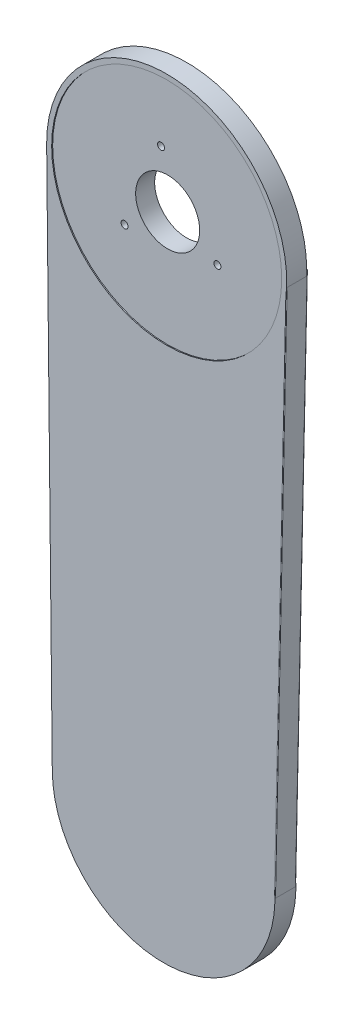
ISO-10303-21;
HEADER;
FILE_DESCRIPTION(('STEP AP214'),'2;1');
FILE_NAME('part.step','',(''),(''),'','','');
FILE_SCHEMA(('AUTOMOTIVE_DESIGN { 1 0 10303 214 1 1 1 1 }'));
ENDSEC;
DATA;
#1=APPLICATION_CONTEXT('core data for automotive mechanical design processes');
#2=APPLICATION_PROTOCOL_DEFINITION('international standard','automotive_design',2000,#1);
#3=PRODUCT_CONTEXT('',#1,'mechanical');
#4=PRODUCT('Part','Part','',(#3));
#5=PRODUCT_RELATED_PRODUCT_CATEGORY('part','',(#4));
#6=PRODUCT_DEFINITION_FORMATION('','',#4);
#7=PRODUCT_DEFINITION_CONTEXT('part definition',#1,'design');
#8=PRODUCT_DEFINITION('design','',#6,#7);
#9=PRODUCT_DEFINITION_SHAPE('','',#8);
#10=(LENGTH_UNIT() NAMED_UNIT(*) SI_UNIT(.MILLI.,.METRE.));
#11=(NAMED_UNIT(*) PLANE_ANGLE_UNIT() SI_UNIT($,.RADIAN.));
#12=(NAMED_UNIT(*) SI_UNIT($,.STERADIAN.) SOLID_ANGLE_UNIT());
#13=UNCERTAINTY_MEASURE_WITH_UNIT(LENGTH_MEASURE(1.E-05),#10,'distance_accuracy_value','');
#14=(GEOMETRIC_REPRESENTATION_CONTEXT(3) GLOBAL_UNCERTAINTY_ASSIGNED_CONTEXT((#13)) GLOBAL_UNIT_ASSIGNED_CONTEXT((#10,
#11,#12)) REPRESENTATION_CONTEXT('',''));
#15=CARTESIAN_POINT('',(0.,0.,0.));
#16=DIRECTION('',(0.,0.,1.));
#17=DIRECTION('',(1.,0.,0.));
#18=AXIS2_PLACEMENT_3D('',#15,#16,#17);
#19=CARTESIAN_POINT('',(0.,0.,0.));
#20=DIRECTION('',(0.,0.,1.));
#21=DIRECTION('',(1.,0.,0.));
#22=AXIS2_PLACEMENT_3D('',#19,#20,#21);
#23=PLANE('',#22);
#24=CARTESIAN_POINT('',(-3.31493579576638,26.7957310157784,0.));
#25=DIRECTION('',(0.,0.,1.));
#26=DIRECTION('',(1.,0.,0.));
#27=AXIS2_PLACEMENT_3D('',#24,#25,#26);
#28=CIRCLE('',#27,1.75);
#29=CARTESIAN_POINT('',(-1.56493579576638,26.7957310157784,0.));
#30=VERTEX_POINT('',#29);
#31=EDGE_CURVE('E334',#30,#30,#28,.T.);
#32=ORIENTED_EDGE('',*,*,#31,.T.);
#33=EDGE_LOOP('',(#32));
#34=FACE_BOUND('',#33,.T.);
#35=CARTESIAN_POINT('',(24.8632516705234,-10.5270468968399,0.));
#36=DIRECTION('',(0.,0.,1.));
#37=DIRECTION('',(1.,0.,0.));
#38=AXIS2_PLACEMENT_3D('',#35,#36,#37);
#39=CIRCLE('',#38,1.75000000000166);
#40=CARTESIAN_POINT('',(26.6132516705251,-10.5270468968399,0.));
#41=VERTEX_POINT('',#40);
#42=EDGE_CURVE('E338',#41,#41,#39,.T.);
#43=ORIENTED_EDGE('',*,*,#42,.T.);
#44=EDGE_LOOP('',(#43));
#45=FACE_BOUND('',#44,.T.);
#46=CARTESIAN_POINT('',(-21.5483158747537,-16.268684118938,0.));
#47=DIRECTION('',(0.,0.,1.));
#48=DIRECTION('',(1.,0.,0.));
#49=AXIS2_PLACEMENT_3D('',#46,#47,#48);
#50=CIRCLE('',#49,1.7500000000021);
#51=CARTESIAN_POINT('',(-19.7983158747515,-16.268684118938,0.));
#52=VERTEX_POINT('',#51);
#53=EDGE_CURVE('E342',#52,#52,#50,.T.);
#54=ORIENTED_EDGE('',*,*,#53,.T.);
#55=EDGE_LOOP('',(#54));
#56=FACE_BOUND('',#55,.T.);
#57=CARTESIAN_POINT('',(0.,0.,0.));
#58=DIRECTION('',(0.,0.,1.));
#59=DIRECTION('',(1.,0.,0.));
#60=AXIS2_PLACEMENT_3D('',#57,#58,#59);
#61=CIRCLE('',#60,16.);
#62=CARTESIAN_POINT('',(16.,0.,0.));
#63=VERTEX_POINT('',#62);
#64=EDGE_CURVE('E247',#63,#63,#61,.T.);
#65=ORIENTED_EDGE('',*,*,#64,.T.);
#66=EDGE_LOOP('',(#65));
#67=FACE_BOUND('',#66,.T.);
#68=DIRECTION('',(1.,0.,0.));
#69=VECTOR('',#68,1.);
#70=CARTESIAN_POINT('',(0.,0.,0.));
#71=LINE('',#70,#69);
#72=CARTESIAN_POINT('',(-60.,0.,0.));
#73=VERTEX_POINT('',#72);
#74=CARTESIAN_POINT('',(-57.5,0.,0.));
#75=VERTEX_POINT('',#74);
#76=EDGE_CURVE('E163',#73,#75,#71,.T.);
#77=ORIENTED_EDGE('',*,*,#76,.F.);
#78=CARTESIAN_POINT('',(0.,0.,0.));
#79=DIRECTION('',(0.,0.,1.));
#80=DIRECTION('',(1.,0.,0.));
#81=AXIS2_PLACEMENT_3D('',#78,#79,#80);
#82=CIRCLE('',#81,60.);
#83=CARTESIAN_POINT('',(60.,0.,0.));
#84=VERTEX_POINT('',#83);
#85=EDGE_CURVE('E235',#84,#73,#82,.T.);
#86=ORIENTED_EDGE('',*,*,#85,.F.);
#87=DIRECTION('',(1.,0.,0.));
#88=VECTOR('',#87,1.);
#89=CARTESIAN_POINT('',(0.,0.,0.));
#90=LINE('',#89,#88);
#91=CARTESIAN_POINT('',(57.5,0.,0.));
#92=VERTEX_POINT('',#91);
#93=EDGE_CURVE('E309',#92,#84,#90,.T.);
#94=ORIENTED_EDGE('',*,*,#93,.F.);
#95=CARTESIAN_POINT('',(0.,0.,0.));
#96=DIRECTION('',(0.,0.,1.));
#97=DIRECTION('',(1.,0.,0.));
#98=AXIS2_PLACEMENT_3D('',#95,#96,#97);
#99=CIRCLE('',#98,57.5);
#100=EDGE_CURVE('E162',#75,#92,#99,.T.);
#101=ORIENTED_EDGE('',*,*,#100,.F.);
#102=EDGE_LOOP('',(#77,#86,#94,#101));
#103=FACE_BOUND('',#102,.T.);
#104=ADVANCED_FACE('F35',(#34,#45,#56,#67,#103),#23,.F.);
#105=CARTESIAN_POINT('',(0.,0.,10.));
#106=DIRECTION('',(0.,0.,-1.));
#107=DIRECTION('',(-1.,0.,0.));
#108=AXIS2_PLACEMENT_3D('',#105,#106,#107);
#109=CYLINDRICAL_SURFACE('',#108,60.);
#110=CARTESIAN_POINT('',(0.,0.,10.));
#111=DIRECTION('',(0.,0.,1.));
#112=DIRECTION('',(1.,0.,0.));
#113=AXIS2_PLACEMENT_3D('',#110,#111,#112);
#114=CIRCLE('',#113,60.);
#115=CARTESIAN_POINT('',(59.5379659201561,-7.43173022184791,10.));
#116=VERTEX_POINT('',#115);
#117=CARTESIAN_POINT('',(-60.,0.,10.));
#118=VERTEX_POINT('',#117);
#119=EDGE_CURVE('E226',#116,#118,#114,.T.);
#120=ORIENTED_EDGE('',*,*,#119,.F.);
#121=CARTESIAN_POINT('',(59.5379659201561,-7.43173022184791,10.));
#122=CARTESIAN_POINT('',(59.5503531498436,-7.3324923029693,9.99999571904773));
#123=CARTESIAN_POINT('',(59.5624920255528,-7.23322504336479,9.99947807760783));
#124=CARTESIAN_POINT('',(59.586272404269,-7.03463866662433,9.99753061587881));
#125=CARTESIAN_POINT('',(59.5979139020012,-6.9353195489497,9.99610078591802));
#126=CARTESIAN_POINT('',(59.6321028352525,-6.63719411996034,9.99061293980004));
#127=CARTESIAN_POINT('',(59.6539017800965,-6.43832332572189,9.98535681055607));
#128=CARTESIAN_POINT('',(59.6955017676844,-6.04045356903482,9.97228148721926));
#129=CARTESIAN_POINT('',(59.7153027378868,-5.84145460219637,9.96446220010838));
#130=CARTESIAN_POINT('',(59.7529070262118,-5.44335181003115,9.94668425539324));
#131=CARTESIAN_POINT('',(59.770710220887,-5.24424797898748,9.93672546569475));
#132=CARTESIAN_POINT('',(59.8043177578237,-4.84597916863208,9.91493034200661));
#133=CARTESIAN_POINT('',(59.8201221383715,-4.64681419056486,9.90309404398971));
#134=CARTESIAN_POINT('',(59.8500156786082,-4.24464965454394,9.87737235965884));
#135=CARTESIAN_POINT('',(59.8640663572584,-4.04164943988062,9.86345218494618));
#136=CARTESIAN_POINT('',(59.8857897477401,-3.7027992559726,9.83826145093849));
#137=CARTESIAN_POINT('',(59.8940352567025,-3.56693822758945,9.82763651224403));
#138=CARTESIAN_POINT('',(59.9070203386452,-3.3402395335886,9.8084907099855));
#139=CARTESIAN_POINT('',(59.9120172648022,-3.24937788776628,9.80043678305276));
#140=CARTESIAN_POINT('',(59.9200076528814,-3.09780332752986,9.7858422480231));
#141=CARTESIAN_POINT('',(59.923117027481,-3.03706068777557,9.77968244182122));
#142=CARTESIAN_POINT('',(59.9281487827066,-2.93575165100342,9.76842122527623));
#143=CARTESIAN_POINT('',(59.9301237861774,-2.89515288030502,9.76364299419177));
#144=CARTESIAN_POINT('',(59.9333482514319,-2.82745584331892,9.75482845651026));
#145=CARTESIAN_POINT('',(59.9346220519516,-2.80032389601779,9.75106771486481));
#146=CARTESIAN_POINT('',(59.9367147778173,-2.75509564579032,9.74407418963082));
#147=CARTESIAN_POINT('',(59.9375454174685,-2.73696483542772,9.74107509002778));
#148=CARTESIAN_POINT('',(59.9389158266422,-2.70675400434865,9.73545959138247));
#149=CARTESIAN_POINT('',(59.9394616820855,-2.69463889638237,9.73304004679617));
#150=CARTESIAN_POINT('',(59.9403645161829,-2.67446588398077,9.72848245675277));
#151=CARTESIAN_POINT('',(59.9407250947511,-2.66637201578516,9.7265094916856));
#152=CARTESIAN_POINT('',(59.9413221623898,-2.65290915718886,9.72277217950516));
#153=CARTESIAN_POINT('',(59.941561154024,-2.647503525759,9.72114588984766));
#154=CARTESIAN_POINT('',(59.9419566190569,-2.63853177777719,9.71804636528278));
#155=CARTESIAN_POINT('',(59.9421151820697,-2.63492695254113,9.71668870518462));
#156=CARTESIAN_POINT('',(59.9423770149364,-2.62896247507679,9.71408329016233));
#157=CARTESIAN_POINT('',(59.9424821819164,-2.62656337748041,9.71293203523478));
#158=CARTESIAN_POINT('',(59.9426363655409,-2.62304156303075,9.71093340259301));
#159=CARTESIAN_POINT('',(59.9426883156201,-2.62185408342681,9.71020160968473));
#160=CARTESIAN_POINT('',(59.9427881648343,-2.61957025112522,9.70860677728096));
#161=CARTESIAN_POINT('',(59.9428360789843,-2.61847356095003,9.70774426101896));
#162=CARTESIAN_POINT('',(59.9428971731889,-2.61707444532123,9.70638910987916));
#163=CARTESIAN_POINT('',(59.9429139986757,-2.61668903013661,9.70598346904962));
#164=CARTESIAN_POINT('',(59.9429455728483,-2.61596563043582,9.70513059132898));
#165=CARTESIAN_POINT('',(59.9429603211028,-2.61562765577011,9.70468334583113));
#166=CARTESIAN_POINT('',(59.9429845922309,-2.61507136436902,9.7038185008136));
#167=CARTESIAN_POINT('',(59.9429945743862,-2.61484253687587,9.70340779118081));
#168=CARTESIAN_POINT('',(59.9430114976153,-2.61445455776814,9.70255541390929));
#169=CARTESIAN_POINT('',(59.9430184515387,-2.61429511175121,9.70211388648853));
#170=CARTESIAN_POINT('',(59.9430264577046,-2.61411153088383,9.7013906721344));
#171=CARTESIAN_POINT('',(59.9430287588156,-2.61405876406065,9.70111619311052));
#172=CARTESIAN_POINT('',(59.9430318704915,-2.61398740885221,9.70056128576075));
#173=CARTESIAN_POINT('',(59.9430326725605,-2.61396901528046,9.70028083258165));
#174=CARTESIAN_POINT('',(59.9430326590117,-2.61396932664719,9.70000000000006));
#175=B_SPLINE_CURVE_WITH_KNOTS('',3,(#121,#122,#123,#124,#125,#126,#127,#128,#129,#130,#131,
#132,#133,#134,#135,#136,#137,#138,#139,#140,#141,#142,#143,#144,#145,#146,#147,#148,#149,#150,
#151,#152,#153,#154,#155,#156,#157,#158,#159,#160,#161,#162,#163,#164,#165,#166,#167,#168,#169,
#170,#171,#172,#173,#174),.UNSPECIFIED.,.F.,.F.,(4,2,2,2,2,2,2,2,2,2,2,2,2,2,2,2,2,2,2,2,2,2,2,
2,2,2,4),(0.,0.300019887137273,0.600042955351859,1.20040222860598,1.80078329155603,
2.40120143306584,3.00160807204738,3.61347075372459,4.02303678784184,4.29709409223668,
4.48048767381555,4.60326103996987,4.68551661606666,4.74069676954466,4.77778740766175,
4.80279481241338,4.81973413216312,4.83129079992363,4.83926333040487,4.84344714714067,
4.84761463962219,4.84929158571328,4.85096887948856,4.85237510715265,4.85377530824305,
4.85461183173625,4.85545308208972),.UNSPECIFIED.);
#176=CARTESIAN_POINT('',(59.9430326590117,-2.61396932664742,9.7));
#177=VERTEX_POINT('',#176);
#178=EDGE_CURVE('E279',#116,#177,#175,.T.);
#179=ORIENTED_EDGE('',*,*,#178,.T.);
#180=DIRECTION('',(0.,0.,-1.));
#181=VECTOR('',#180,1.);
#182=CARTESIAN_POINT('',(59.9430326590117,-2.61396932664742,10.));
#183=LINE('',#182,#181);
#184=CARTESIAN_POINT('',(59.9430326590117,-2.61396932664742,0.));
#185=VERTEX_POINT('',#184);
#186=EDGE_CURVE('E169',#177,#185,#183,.T.);
#187=ORIENTED_EDGE('',*,*,#186,.T.);
#188=EDGE_CURVE('E242',#185,#84,#82,.T.);
#189=ORIENTED_EDGE('',*,*,#188,.T.);
#190=ORIENTED_EDGE('',*,*,#85,.T.);
#191=CARTESIAN_POINT('',(0.,0.,0.));
#192=DIRECTION('',(0.,0.,1.));
#193=DIRECTION('',(-1.,0.,0.));
#194=AXIS2_PLACEMENT_3D('',#191,#192,#193);
#195=CIRCLE('',#194,60.);
#196=CARTESIAN_POINT('',(-59.9868890893857,-1.25424773380039,0.));
#197=VERTEX_POINT('',#196);
#198=EDGE_CURVE('E175',#73,#197,#195,.T.);
#199=ORIENTED_EDGE('',*,*,#198,.T.);
#200=DIRECTION('',(0.,0.,-1.));
#201=VECTOR('',#200,1.);
#202=CARTESIAN_POINT('',(-59.9868890893857,-1.2542477337997,10.));
#203=LINE('',#202,#201);
#204=CARTESIAN_POINT('',(-59.9868890893857,-1.25424773380039,10.));
#205=VERTEX_POINT('',#204);
#206=EDGE_CURVE('E166',#197,#205,#203,.F.);
#207=ORIENTED_EDGE('',*,*,#206,.T.);
#208=CARTESIAN_POINT('',(-60.,0.,10.));
#209=DIRECTION('',(0.0104526354788013,-0.999945369713539,0.));
#210=VECTOR('',#209,1.);
#211=LINE('',#208,#210);
#212=EDGE_CURVE('E128',#118,#205,#211,.T.);
#213=ORIENTED_EDGE('',*,*,#212,.F.);
#214=EDGE_LOOP('',(#120,#179,#187,#189,#190,#199,#207,#213));
#215=FACE_BOUND('',#214,.T.);
#216=ADVANCED_FACE('F218',(#215),#109,.T.);
#217=CARTESIAN_POINT('',(0.,0.,10.));
#218=DIRECTION('',(0.,0.,1.));
#219=DIRECTION('',(1.,0.,0.));
#220=AXIS2_PLACEMENT_3D('',#217,#218,#219);
#221=PLANE('',#220);
#222=CARTESIAN_POINT('',(0.,0.,10.));
#223=DIRECTION('',(0.,0.,1.));
#224=DIRECTION('',(1.,0.,0.));
#225=AXIS2_PLACEMENT_3D('',#222,#223,#224);
#226=CIRCLE('',#225,57.5);
#227=CARTESIAN_POINT('',(57.5,0.,10.));
#228=VERTEX_POINT('',#227);
#229=EDGE_CURVE('E240',#228,#228,#226,.T.);
#230=ORIENTED_EDGE('',*,*,#229,.F.);
#231=EDGE_LOOP('',(#230));
#232=FACE_BOUND('',#231,.T.);
#233=DIRECTION('',(0.0217882500804667,0.999762607901711,0.));
#234=VECTOR('',#233,1.);
#235=CARTESIAN_POINT('',(59.6715875471354,-1.30044818829959,10.));
#236=LINE('',#235,#234);
#237=CARTESIAN_POINT('',(53.9192859490369,-265.247117880135,10.));
#238=VERTEX_POINT('',#237);
#239=EDGE_CURVE('E270',#238,#116,#236,.T.);
#240=ORIENTED_EDGE('',*,*,#239,.T.);
#241=ORIENTED_EDGE('',*,*,#119,.T.);
#242=ORIENTED_EDGE('',*,*,#212,.T.);
#243=DIRECTION('',(0.0104526354788007,-0.99994536971354,0.));
#244=VECTOR('',#243,1.);
#245=CARTESIAN_POINT('',(-59.9934445446928,-0.627123866899812,10.));
#246=LINE('',#245,#244);
#247=CARTESIAN_POINT('',(-57.1783042414048,-269.935904133462,10.));
#248=VERTEX_POINT('',#247);
#249=EDGE_CURVE('E120',#205,#248,#246,.T.);
#250=ORIENTED_EDGE('',*,*,#249,.T.);
#251=CARTESIAN_POINT('',(-1.53056588156543,-269.935904133462,10.));
#252=DIRECTION('',(0.,0.,1.));
#253=DIRECTION('',(1.,0.,0.));
#254=AXIS2_PLACEMENT_3D('',#251,#252,#253);
#255=CIRCLE('',#254,55.6477383598394);
#256=EDGE_CURVE('E125',#248,#238,#255,.T.);
#257=ORIENTED_EDGE('',*,*,#256,.T.);
#258=EDGE_LOOP('',(#240,#241,#242,#250,#257));
#259=FACE_BOUND('',#258,.T.);
#260=ADVANCED_FACE('F123',(#232,#259),#221,.T.);
#261=ORIENTED_EDGE('',*,*,#188,.F.);
#262=DIRECTION('',(0.0217882500804667,0.999762607901711,0.));
#263=VECTOR('',#262,1.);
#264=CARTESIAN_POINT('',(59.9715163295059,-1.30698466332373,0.));
#265=LINE('',#264,#263);
#266=EDGE_CURVE('E234',#185,#84,#265,.T.);
#267=ORIENTED_EDGE('',*,*,#266,.T.);
#268=EDGE_LOOP('',(#261,#267));
#269=FACE_BOUND('',#268,.T.);
#270=ADVANCED_FACE('F213',(#269),#23,.F.);
#271=CARTESIAN_POINT('',(0.,0.,9.5));
#272=DIRECTION('',(0.,0.,1.));
#273=DIRECTION('',(1.,0.,0.));
#274=AXIS2_PLACEMENT_3D('',#271,#272,#273);
#275=CYLINDRICAL_SURFACE('',#274,57.5);
#276=ORIENTED_EDGE('',*,*,#229,.T.);
#277=EDGE_LOOP('',(#276));
#278=FACE_BOUND('',#277,.T.);
#279=CARTESIAN_POINT('',(0.,0.,9.5));
#280=DIRECTION('',(0.,0.,1.));
#281=DIRECTION('',(1.,0.,0.));
#282=AXIS2_PLACEMENT_3D('',#279,#280,#281);
#283=CIRCLE('',#282,57.5);
#284=CARTESIAN_POINT('',(57.5,0.,9.5));
#285=VERTEX_POINT('',#284);
#286=EDGE_CURVE('E246',#285,#285,#283,.T.);
#287=ORIENTED_EDGE('',*,*,#286,.F.);
#288=EDGE_LOOP('',(#287));
#289=FACE_BOUND('',#288,.T.);
#290=ADVANCED_FACE('F209',(#278,#289),#275,.F.);
#291=CARTESIAN_POINT('',(0.,0.,9.5));
#292=DIRECTION('',(0.,0.,1.));
#293=DIRECTION('',(1.,0.,0.));
#294=AXIS2_PLACEMENT_3D('',#291,#292,#293);
#295=PLANE('',#294);
#296=CARTESIAN_POINT('',(-3.31493579576638,26.7957310157784,9.5));
#297=DIRECTION('',(0.,0.,1.));
#298=DIRECTION('',(1.,0.,0.));
#299=AXIS2_PLACEMENT_3D('',#296,#297,#298);
#300=CIRCLE('',#299,1.75);
#301=CARTESIAN_POINT('',(-1.56493579576638,26.7957310157784,9.5));
#302=VERTEX_POINT('',#301);
#303=EDGE_CURVE('E499',#302,#302,#300,.T.);
#304=ORIENTED_EDGE('',*,*,#303,.F.);
#305=EDGE_LOOP('',(#304));
#306=FACE_BOUND('',#305,.T.);
#307=CARTESIAN_POINT('',(24.8632516705234,-10.5270468968399,9.5));
#308=DIRECTION('',(0.,0.,1.));
#309=DIRECTION('',(1.,0.,0.));
#310=AXIS2_PLACEMENT_3D('',#307,#308,#309);
#311=CIRCLE('',#310,1.75000000000166);
#312=CARTESIAN_POINT('',(26.6132516705251,-10.5270468968399,9.5));
#313=VERTEX_POINT('',#312);
#314=EDGE_CURVE('E502',#313,#313,#311,.T.);
#315=ORIENTED_EDGE('',*,*,#314,.F.);
#316=EDGE_LOOP('',(#315));
#317=FACE_BOUND('',#316,.T.);
#318=CARTESIAN_POINT('',(-21.5483158747537,-16.268684118938,9.5));
#319=DIRECTION('',(0.,0.,1.));
#320=DIRECTION('',(1.,0.,0.));
#321=AXIS2_PLACEMENT_3D('',#318,#319,#320);
#322=CIRCLE('',#321,1.7500000000021);
#323=CARTESIAN_POINT('',(-19.7983158747515,-16.268684118938,9.5));
#324=VERTEX_POINT('',#323);
#325=EDGE_CURVE('E168',#324,#324,#322,.T.);
#326=ORIENTED_EDGE('',*,*,#325,.F.);
#327=EDGE_LOOP('',(#326));
#328=FACE_BOUND('',#327,.T.);
#329=CARTESIAN_POINT('',(0.,0.,9.5));
#330=DIRECTION('',(0.,0.,1.));
#331=DIRECTION('',(1.,0.,0.));
#332=AXIS2_PLACEMENT_3D('',#329,#330,#331);
#333=CIRCLE('',#332,16.);
#334=CARTESIAN_POINT('',(16.,0.,9.5));
#335=VERTEX_POINT('',#334);
#336=EDGE_CURVE('E486',#335,#335,#333,.T.);
#337=ORIENTED_EDGE('',*,*,#336,.F.);
#338=EDGE_LOOP('',(#337));
#339=FACE_BOUND('',#338,.T.);
#340=ORIENTED_EDGE('',*,*,#286,.T.);
#341=EDGE_LOOP('',(#340));
#342=FACE_BOUND('',#341,.T.);
#343=ADVANCED_FACE('F205',(#306,#317,#328,#339,#342),#295,.T.);
#344=CARTESIAN_POINT('',(0.,0.,-20.5));
#345=DIRECTION('',(0.,0.,1.));
#346=DIRECTION('',(1.,0.,0.));
#347=AXIS2_PLACEMENT_3D('',#344,#345,#346);
#348=CYLINDRICAL_SURFACE('',#347,16.);
#349=ORIENTED_EDGE('',*,*,#336,.T.);
#350=EDGE_LOOP('',(#349));
#351=FACE_BOUND('',#350,.T.);
#352=ORIENTED_EDGE('',*,*,#64,.F.);
#353=EDGE_LOOP('',(#352));
#354=FACE_BOUND('',#353,.T.);
#355=ADVANCED_FACE('F201',(#351,#354),#348,.F.);
#356=CARTESIAN_POINT('',(-21.5483158747537,-16.268684118938,-20.5));
#357=DIRECTION('',(0.,0.,1.));
#358=DIRECTION('',(1.,0.,0.));
#359=AXIS2_PLACEMENT_3D('',#356,#357,#358);
#360=CYLINDRICAL_SURFACE('',#359,1.7500000000021);
#361=ORIENTED_EDGE('',*,*,#325,.T.);
#362=EDGE_LOOP('',(#361));
#363=FACE_BOUND('',#362,.T.);
#364=ORIENTED_EDGE('',*,*,#53,.F.);
#365=EDGE_LOOP('',(#364));
#366=FACE_BOUND('',#365,.T.);
#367=ADVANCED_FACE('F197',(#363,#366),#360,.F.);
#368=CARTESIAN_POINT('',(24.8632516705234,-10.5270468968399,-20.5));
#369=DIRECTION('',(0.,0.,1.));
#370=DIRECTION('',(1.,0.,0.));
#371=AXIS2_PLACEMENT_3D('',#368,#369,#370);
#372=CYLINDRICAL_SURFACE('',#371,1.75000000000166);
#373=ORIENTED_EDGE('',*,*,#314,.T.);
#374=EDGE_LOOP('',(#373));
#375=FACE_BOUND('',#374,.T.);
#376=ORIENTED_EDGE('',*,*,#42,.F.);
#377=EDGE_LOOP('',(#376));
#378=FACE_BOUND('',#377,.T.);
#379=ADVANCED_FACE('F193',(#375,#378),#372,.F.);
#380=CARTESIAN_POINT('',(-3.31493579576638,26.7957310157784,-20.5));
#381=DIRECTION('',(0.,0.,1.));
#382=DIRECTION('',(1.,0.,0.));
#383=AXIS2_PLACEMENT_3D('',#380,#381,#382);
#384=CYLINDRICAL_SURFACE('',#383,1.75);
#385=ORIENTED_EDGE('',*,*,#303,.T.);
#386=EDGE_LOOP('',(#385));
#387=FACE_BOUND('',#386,.T.);
#388=ORIENTED_EDGE('',*,*,#31,.F.);
#389=EDGE_LOOP('',(#388));
#390=FACE_BOUND('',#389,.T.);
#391=ADVANCED_FACE('F188',(#387,#390),#384,.F.);
#392=CARTESIAN_POINT('',(-59.9934445446928,-0.627123866899812,-0.5));
#393=DIRECTION('',(-0.99994536971354,-0.0104526354788007,0.));
#394=DIRECTION('',(0.0104526354788007,-0.99994536971354,0.));
#395=AXIS2_PLACEMENT_3D('',#392,#393,#394);
#396=PLANE('',#395);
#397=ORIENTED_EDGE('',*,*,#206,.F.);
#398=ORIENTED_EDGE('',*,*,#198,.F.);
#399=DIRECTION('',(0.,0.,1.));
#400=VECTOR('',#399,1.);
#401=CARTESIAN_POINT('',(-60.,0.,-0.5));
#402=LINE('',#401,#400);
#403=CARTESIAN_POINT('',(-60.,0.,-0.5));
#404=VERTEX_POINT('',#403);
#405=EDGE_CURVE('E158',#404,#73,#402,.T.);
#406=ORIENTED_EDGE('',*,*,#405,.F.);
#407=DIRECTION('',(0.0104526354788007,-0.99994536971354,0.));
#408=VECTOR('',#407,1.);
#409=CARTESIAN_POINT('',(-59.9934445446928,-0.627123866899812,-0.5));
#410=LINE('',#409,#408);
#411=CARTESIAN_POINT('',(-57.1783042414048,-269.935904133462,-0.5));
#412=VERTEX_POINT('',#411);
#413=EDGE_CURVE('E137',#404,#412,#410,.T.);
#414=ORIENTED_EDGE('',*,*,#413,.T.);
#415=DIRECTION('',(0.,0.,1.));
#416=VECTOR('',#415,1.);
#417=CARTESIAN_POINT('',(-57.1783042414048,-269.935904133462,-0.5));
#418=LINE('',#417,#416);
#419=EDGE_CURVE('E134',#412,#248,#418,.T.);
#420=ORIENTED_EDGE('',*,*,#419,.T.);
#421=ORIENTED_EDGE('',*,*,#249,.F.);
#422=EDGE_LOOP('',(#397,#398,#406,#414,#420,#421));
#423=FACE_BOUND('',#422,.T.);
#424=ADVANCED_FACE('F135',(#423),#396,.T.);
#425=CARTESIAN_POINT('',(59.9715163295059,-1.30698466332373,-0.5));
#426=DIRECTION('',(0.999762607901711,-0.0217882500804667,0.));
#427=DIRECTION('',(0.0217882500804667,0.999762607901711,0.));
#428=AXIS2_PLACEMENT_3D('',#425,#426,#427);
#429=PLANE('',#428);
#430=DIRECTION('',(0.,0.,1.));
#431=VECTOR('',#430,1.);
#432=CARTESIAN_POINT('',(54.117172478274,-269.935904133462,-0.5));
#433=LINE('',#432,#431);
#434=CARTESIAN_POINT('',(54.117172478274,-269.935904133462,-0.2));
#435=VERTEX_POINT('',#434);
#436=CARTESIAN_POINT('',(54.117172478274,-269.935904133462,9.7));
#437=VERTEX_POINT('',#436);
#438=EDGE_CURVE('E138',#435,#437,#433,.T.);
#439=ORIENTED_EDGE('',*,*,#438,.F.);
#440=DIRECTION('',(0.0217882500804667,0.999762607901711,0.));
#441=VECTOR('',#440,1.);
#442=CARTESIAN_POINT('',(60.,0.,-0.2));
#443=LINE('',#442,#441);
#444=CARTESIAN_POINT('',(60.,0.,-0.2));
#445=VERTEX_POINT('',#444);
#446=EDGE_CURVE('E290',#435,#445,#443,.T.);
#447=ORIENTED_EDGE('',*,*,#446,.T.);
#448=DIRECTION('',(0.,0.,1.));
#449=VECTOR('',#448,1.);
#450=CARTESIAN_POINT('',(60.,0.,-0.5));
#451=LINE('',#450,#449);
#452=EDGE_CURVE('E303',#445,#84,#451,.T.);
#453=ORIENTED_EDGE('',*,*,#452,.T.);
#454=ORIENTED_EDGE('',*,*,#266,.F.);
#455=ORIENTED_EDGE('',*,*,#186,.F.);
#456=DIRECTION('',(0.0217882500804667,0.999762607901711,0.));
#457=VECTOR('',#456,1.);
#458=CARTESIAN_POINT('',(59.9715163295059,-1.30698466332373,9.7));
#459=LINE('',#458,#457);
#460=EDGE_CURVE('E277',#177,#437,#459,.F.);
#461=ORIENTED_EDGE('',*,*,#460,.T.);
#462=EDGE_LOOP('',(#439,#447,#453,#454,#455,#461));
#463=FACE_BOUND('',#462,.T.);
#464=ADVANCED_FACE('F187',(#463),#429,.T.);
#465=CARTESIAN_POINT('',(0.,0.,-0.5));
#466=DIRECTION('',(0.,-1.,0.));
#467=DIRECTION('',(1.,0.,0.));
#468=AXIS2_PLACEMENT_3D('',#465,#466,#467);
#469=PLANE('',#468);
#470=ORIENTED_EDGE('',*,*,#405,.T.);
#471=ORIENTED_EDGE('',*,*,#76,.T.);
#472=DIRECTION('',(0.,0.,1.));
#473=VECTOR('',#472,1.);
#474=CARTESIAN_POINT('',(-57.5,0.,-0.5));
#475=LINE('',#474,#473);
#476=CARTESIAN_POINT('',(-57.5,0.,-0.5));
#477=VERTEX_POINT('',#476);
#478=EDGE_CURVE('E155',#477,#75,#475,.T.);
#479=ORIENTED_EDGE('',*,*,#478,.F.);
#480=DIRECTION('',(1.,0.,0.));
#481=VECTOR('',#480,1.);
#482=CARTESIAN_POINT('',(0.,0.,-0.5));
#483=LINE('',#482,#481);
#484=EDGE_CURVE('E139',#404,#477,#483,.T.);
#485=ORIENTED_EDGE('',*,*,#484,.F.);
#486=EDGE_LOOP('',(#470,#471,#479,#485));
#487=FACE_BOUND('',#486,.T.);
#488=ADVANCED_FACE('F353',(#487),#469,.F.);
#489=ORIENTED_EDGE('',*,*,#452,.F.);
#490=CARTESIAN_POINT('',(59.69992876546,0.,-0.2));
#491=DIRECTION('',(0.,-1.,0.));
#492=DIRECTION('',(-1.,0.,0.));
#493=AXIS2_PLACEMENT_3D('',#490,#491,#492);
#494=ELLIPSE('',#493,0.300071234540003,0.3);
#495=CARTESIAN_POINT('',(59.69992876546,0.,-0.5));
#496=VERTEX_POINT('',#495);
#497=EDGE_CURVE('E63',#445,#496,#494,.F.);
#498=ORIENTED_EDGE('',*,*,#497,.T.);
#499=CARTESIAN_POINT('',(57.5,0.,-0.5));
#500=VERTEX_POINT('',#499);
#501=EDGE_CURVE('E149',#500,#496,#483,.T.);
#502=ORIENTED_EDGE('',*,*,#501,.F.);
#503=DIRECTION('',(0.,0.,1.));
#504=VECTOR('',#503,1.);
#505=CARTESIAN_POINT('',(57.5,0.,-0.5));
#506=LINE('',#505,#504);
#507=EDGE_CURVE('E305',#500,#92,#506,.T.);
#508=ORIENTED_EDGE('',*,*,#507,.T.);
#509=ORIENTED_EDGE('',*,*,#93,.T.);
#510=EDGE_LOOP('',(#489,#498,#502,#508,#509));
#511=FACE_BOUND('',#510,.T.);
#512=ADVANCED_FACE('F351',(#511),#469,.F.);
#513=CARTESIAN_POINT('',(0.,0.,-0.5));
#514=DIRECTION('',(0.,0.,1.));
#515=DIRECTION('',(1.,0.,0.));
#516=AXIS2_PLACEMENT_3D('',#513,#514,#515);
#517=CYLINDRICAL_SURFACE('',#516,57.5);
#518=ORIENTED_EDGE('',*,*,#478,.T.);
#519=ORIENTED_EDGE('',*,*,#100,.T.);
#520=ORIENTED_EDGE('',*,*,#507,.F.);
#521=CARTESIAN_POINT('',(0.,0.,-0.5));
#522=DIRECTION('',(0.,0.,1.));
#523=DIRECTION('',(1.,0.,0.));
#524=AXIS2_PLACEMENT_3D('',#521,#522,#523);
#525=CIRCLE('',#524,57.5);
#526=EDGE_CURVE('E151',#477,#500,#525,.T.);
#527=ORIENTED_EDGE('',*,*,#526,.F.);
#528=EDGE_LOOP('',(#518,#519,#520,#527));
#529=FACE_BOUND('',#528,.T.);
#530=ADVANCED_FACE('F349',(#529),#517,.F.);
#531=CARTESIAN_POINT('',(-1.53056588156543,-269.935904133462,-0.5));
#532=DIRECTION('',(0.,0.,1.));
#533=DIRECTION('',(1.,0.,0.));
#534=AXIS2_PLACEMENT_3D('',#531,#532,#533);
#535=CYLINDRICAL_SURFACE('',#534,55.6477383598394);
#536=CARTESIAN_POINT('',(-1.53056588156543,-269.935904133462,-0.5));
#537=DIRECTION('',(0.,0.,1.));
#538=DIRECTION('',(1.,0.,0.));
#539=AXIS2_PLACEMENT_3D('',#536,#537,#538);
#540=CIRCLE('',#539,55.6477383598394);
#541=CARTESIAN_POINT('',(53.9192859490369,-265.247117880135,-0.5));
#542=VERTEX_POINT('',#541);
#543=EDGE_CURVE('E55',#412,#542,#540,.T.);
#544=ORIENTED_EDGE('',*,*,#543,.T.);
#545=CARTESIAN_POINT('',(53.9192859490369,-265.247117880135,-0.5));
#546=CARTESIAN_POINT('',(53.9277125829505,-265.34677148209,-0.499995097068637));
#547=CARTESIAN_POINT('',(53.9358703671065,-265.446445883012,-0.499439244397608));
#548=CARTESIAN_POINT('',(53.9516478095627,-265.645828524062,-0.497352474354098));
#549=CARTESIAN_POINT('',(53.9592674611307,-265.745536764596,-0.495821544785468));
#550=CARTESIAN_POINT('',(53.9813269452597,-266.044814545181,-0.489954113777621));
#551=CARTESIAN_POINT('',(53.9949573613319,-266.24441952151,-0.484343274609885));
#552=CARTESIAN_POINT('',(54.0200598883463,-266.643674923598,-0.470417629919128));
#553=CARTESIAN_POINT('',(54.0315319088405,-266.843325350909,-0.462102711121059));
#554=CARTESIAN_POINT('',(54.0523192122816,-267.242645213503,-0.443230434144332));
#555=CARTESIAN_POINT('',(54.0616343491587,-267.442314649156,-0.432672924184456));
#556=CARTESIAN_POINT('',(54.0781088295879,-267.841623695734,-0.409597333572774));
#557=CARTESIAN_POINT('',(54.0852682227758,-268.041263307239,-0.397079298071935));
#558=CARTESIAN_POINT('',(54.0970755676258,-268.428718432538,-0.370925886663725));
#559=CARTESIAN_POINT('',(54.1018466440203,-268.616537525573,-0.357399809271762));
#560=CARTESIAN_POINT('',(54.1082215157226,-268.929961595981,-0.333008525959156));
#561=CARTESIAN_POINT('',(54.1103509537495,-269.055602208959,-0.322742433781899));
#562=CARTESIAN_POINT('',(54.1131939382583,-269.265203997602,-0.304273421851535));
#563=CARTESIAN_POINT('',(54.1141428407984,-269.349200164822,-0.2965118524036));
#564=CARTESIAN_POINT('',(54.1154086628886,-269.489299027739,-0.282458024171624));
#565=CARTESIAN_POINT('',(54.1158308054328,-269.545436396436,-0.276529174739175));
#566=CARTESIAN_POINT('',(54.11639335474,-269.639051503454,-0.265693963347935));
#567=CARTESIAN_POINT('',(54.1165807645127,-269.676563873533,-0.261097353920534));
#568=CARTESIAN_POINT('',(54.1168301460832,-269.739106137121,-0.252618704125738));
#569=CARTESIAN_POINT('',(54.1169131033983,-269.764170780817,-0.249001307701502));
#570=CARTESIAN_POINT('',(54.1170232577843,-269.805946915015,-0.242273862637391));
#571=CARTESIAN_POINT('',(54.1170598206075,-269.822693468582,-0.239388470707759));
#572=CARTESIAN_POINT('',(54.1171082147512,-269.850592898801,-0.233984627713696));
#573=CARTESIAN_POINT('',(54.1171242240936,-269.861781214452,-0.231655569828531));
#574=CARTESIAN_POINT('',(54.1171453099617,-269.880406534384,-0.227266657890798));
#575=CARTESIAN_POINT('',(54.117152248836,-269.88787980069,-0.225365725086122));
#576=CARTESIAN_POINT('',(54.1171613182171,-269.900305879567,-0.221762496219068));
#577=CARTESIAN_POINT('',(54.1171642775317,-269.905295664512,-0.220193226077336));
#578=CARTESIAN_POINT('',(54.1171680986026,-269.913571975426,-0.217199588942398));
#579=CARTESIAN_POINT('',(54.1171693278113,-269.916897639009,-0.215886619138629));
#580=CARTESIAN_POINT('',(54.1171708833186,-269.922394072848,-0.213363188769524));
#581=CARTESIAN_POINT('',(54.1171713711362,-269.924604878713,-0.212245855690918));
#582=CARTESIAN_POINT('',(54.1171719075383,-269.927853333294,-0.210295963721773));
#583=CARTESIAN_POINT('',(54.1171720548568,-269.928956680327,-0.209574104938902));
#584=CARTESIAN_POINT('',(54.1171722776912,-269.931066119743,-0.207999292975272));
#585=CARTESIAN_POINT('',(54.1171723535226,-269.932072621798,-0.207146935471599));
#586=CARTESIAN_POINT('',(54.1171724202318,-269.933335639751,-0.205809642655247));
#587=CARTESIAN_POINT('',(54.1171724347954,-269.933680816499,-0.205409654077805));
#588=CARTESIAN_POINT('',(54.1171724566518,-269.93432076695,-0.204570344842209));
#589=CARTESIAN_POINT('',(54.117172463947,-269.934615559198,-0.204131038746306));
#590=CARTESIAN_POINT('',(54.117172472702,-269.935087703018,-0.203289567853464));
#591=CARTESIAN_POINT('',(54.1171724749475,-269.935276523488,-0.202893942685708));
#592=CARTESIAN_POINT('',(54.1171724775877,-269.935586636556,-0.202077482940163));
#593=CARTESIAN_POINT('',(54.1171724779887,-269.935708161502,-0.201656740728895));
#594=CARTESIAN_POINT('',(54.1171724782324,-269.935826703394,-0.201026374575374));
#595=CARTESIAN_POINT('',(54.1171724782581,-269.935855582837,-0.200822484820062));
#596=CARTESIAN_POINT('',(54.1171724782746,-269.935894356068,-0.200412446885175));
#597=CARTESIAN_POINT('',(54.1171724782653,-269.935904206334,-0.200206294610348));
#598=CARTESIAN_POINT('',(54.117172478274,-269.935904133463,-0.200000000000152));
#599=B_SPLINE_CURVE_WITH_KNOTS('',3,(#545,#546,#547,#548,#549,#550,#551,#552,#553,#554,#555,
#556,#557,#558,#559,#560,#561,#562,#563,#564,#565,#566,#567,#568,#569,#570,#571,#572,#573,#574,
#575,#576,#577,#578,#579,#580,#581,#582,#583,#584,#585,#586,#587,#588,#589,#590,#591,#592,#593,
#594,#595,#596,#597,#598),.UNSPECIFIED.,.F.,.F.,(4,2,2,2,2,2,2,2,2,2,2,2,2,2,2,2,2,2,2,2,2,2,2,
2,2,2,4),(0.,0.300022812942597,0.600049378609716,1.20045656760857,1.80088891116105,
2.40136190563946,3.00182107323842,3.5668994201144,3.94512268227292,4.198194245603,
4.36754149816098,4.48091510274933,4.55688123736927,4.60785355953381,4.6421294345407,
4.66525448338824,4.68093573302966,4.69165272667528,4.69906666015114,4.70301817336234,
4.70695215945621,4.70853447435761,4.71011620561437,4.71142683188532,4.71273290436749,
4.71334988379111,4.71396827269056),.UNSPECIFIED.);
#600=EDGE_CURVE('E11',#542,#435,#599,.T.);
#601=ORIENTED_EDGE('',*,*,#600,.T.);
#602=ORIENTED_EDGE('',*,*,#438,.T.);
#603=CARTESIAN_POINT('',(54.117172478274,-269.935904133462,9.7));
#604=CARTESIAN_POINT('',(54.1171724781542,-269.935905379734,9.70040754410588));
#605=CARTESIAN_POINT('',(54.1171724782805,-269.935866072297,9.70081334243666));
#606=CARTESIAN_POINT('',(54.1171724780417,-269.935718210248,9.70160671334328));
#607=CARTESIAN_POINT('',(54.1171724776832,-269.935610597311,9.70199445797622));
#608=CARTESIAN_POINT('',(54.117172475195,-269.935293424585,9.70286993750823));
#609=CARTESIAN_POINT('',(54.117172472532,-269.935062190881,9.703349644467));
#610=CARTESIAN_POINT('',(54.1171724618958,-269.934527119447,9.70426880835257));
#611=CARTESIAN_POINT('',(54.1171724538901,-269.934222842794,9.70470799883431));
#612=CARTESIAN_POINT('',(54.1171724199371,-269.933286291076,9.70590468555785));
#613=CARTESIAN_POINT('',(54.1171723845227,-269.932595102343,9.70661532452345));
#614=CARTESIAN_POINT('',(54.117172278161,-269.931125417,9.7079374336727));
#615=CARTESIAN_POINT('',(54.1171722071215,-269.930346698132,9.70854864129781));
#616=CARTESIAN_POINT('',(54.1171717163248,-269.92607877747,9.71163611744602));
#617=CARTESIAN_POINT('',(54.1171709231382,-269.922199829607,9.71354450415354));
#618=CARTESIAN_POINT('',(54.1171684224589,-269.914267721403,9.71695357880382));
#619=CARTESIAN_POINT('',(54.1171667054407,-269.910213158164,9.7184497691196));
#620=CARTESIAN_POINT('',(54.1171558835526,-269.890058581018,9.72530651379401));
#621=CARTESIAN_POINT('',(54.1171398663989,-269.873445766672,9.72915658525819));
#622=CARTESIAN_POINT('',(54.1170927301039,-269.840216140148,9.73608950710052));
#623=CARTESIAN_POINT('',(54.1170616780631,-269.823599670561,9.73917567515359));
#624=CARTESIAN_POINT('',(54.1169460451012,-269.773741520471,9.7477287880352));
#625=CARTESIAN_POINT('',(54.1168389248008,-269.740367530793,9.75251859199182));
#626=CARTESIAN_POINT('',(54.1165640229727,-269.673530537373,9.76142609681098));
#627=CARTESIAN_POINT('',(54.1163962015905,-269.64006748952,9.76554335351475));
#628=CARTESIAN_POINT('',(54.1158009957644,-269.539504883595,9.7772764561027));
#629=CARTESIAN_POINT('',(54.1152820901663,-269.472328024944,9.78425995939791));
#630=CARTESIAN_POINT('',(54.1133606329156,-269.270883094872,9.80409512687237));
#631=CARTESIAN_POINT('',(54.1115929274113,-269.136519138284,9.8158533142589));
#632=CARTESIAN_POINT('',(54.1070810212967,-268.867675946722,9.8380261842368));
#633=CARTESIAN_POINT('',(54.1043366630024,-268.733196696632,9.84844064950939));
#634=CARTESIAN_POINT('',(54.0978737150826,-268.464320291358,9.86826555829767));
#635=CARTESIAN_POINT('',(54.0941560791285,-268.329923184188,9.8776769720262));
#636=CARTESIAN_POINT('',(54.0857447324806,-268.061107875531,9.89562574050136));
#637=CARTESIAN_POINT('',(54.081051067585,-267.926689675328,9.90416313623152));
#638=CARTESIAN_POINT('',(54.0676962149281,-267.580262699064,9.92503954193411));
#639=CARTESIAN_POINT('',(54.0583085345047,-267.368241809284,9.93672927379308));
#640=CARTESIAN_POINT('',(54.0371005361774,-266.944198856783,9.95766087547221));
#641=CARTESIAN_POINT('',(54.0252801981608,-266.732176794066,9.96690272505235));
#642=CARTESIAN_POINT('',(53.9991897164175,-266.307923178644,9.98242670255888));
#643=CARTESIAN_POINT('',(53.9849167544558,-266.095691667339,9.9887053941672));
#644=CARTESIAN_POINT('',(53.9616774102958,-265.777414498417,9.99529074776139));
#645=CARTESIAN_POINT('',(53.953625700821,-265.671330505267,9.99701376115489));
#646=CARTESIAN_POINT('',(53.9369127750518,-265.459195851319,9.99936531632966));
#647=CARTESIAN_POINT('',(53.9282515426992,-265.353145191472,9.99999382926448));
#648=CARTESIAN_POINT('',(53.9192859490369,-265.247117880135,10.));
#649=B_SPLINE_CURVE_WITH_KNOTS('',3,(#603,#604,#605,#606,#607,#608,#609,#610,#611,#612,#613,
#614,#615,#616,#617,#618,#619,#620,#621,#622,#623,#624,#625,#626,#627,#628,#629,#630,#631,#632,
#633,#634,#635,#636,#637,#638,#639,#640,#641,#642,#643,#644,#645,#646,#647,#648),.UNSPECIFIED.,
.F.,.F.,(4,2,2,2,2,2,2,2,2,2,2,2,2,2,2,2,2,2,2,2,2,2,4),(0.,0.00121792919930207,
0.00241942202470401,0.00400797115418582,0.00560631614137167,0.00856363508934155,
0.0115286406455691,0.0243683437703,0.03734304700534,0.0883029806853955,0.139037548137707,
0.240126345720094,0.341281636059275,0.543883574868762,0.948539179515368,1.35326014687808,
1.75758602093443,2.16189292708685,2.79951584702754,3.43714403891038,4.07550987004504,
4.39471257075588,4.71392368419019),.UNSPECIFIED.);
#650=EDGE_CURVE('E143',#437,#238,#649,.T.);
#651=ORIENTED_EDGE('',*,*,#650,.T.);
#652=ORIENTED_EDGE('',*,*,#256,.F.);
#653=ORIENTED_EDGE('',*,*,#419,.F.);
#654=EDGE_LOOP('',(#544,#601,#602,#651,#652,#653));
#655=FACE_BOUND('',#654,.T.);
#656=ADVANCED_FACE('F141',(#655),#535,.T.);
#657=CARTESIAN_POINT('',(0.,0.,-0.5));
#658=DIRECTION('',(0.,0.,1.));
#659=DIRECTION('',(1.,0.,0.));
#660=AXIS2_PLACEMENT_3D('',#657,#658,#659);
#661=PLANE('',#660);
#662=ORIENTED_EDGE('',*,*,#501,.T.);
#663=DIRECTION('',(0.0217882500804667,0.999762607901711,0.));
#664=VECTOR('',#663,1.);
#665=CARTESIAN_POINT('',(53.8172436959035,-269.929367658438,-0.5));
#666=LINE('',#665,#664);
#667=EDGE_CURVE('E49',#496,#542,#666,.F.);
#668=ORIENTED_EDGE('',*,*,#667,.T.);
#669=ORIENTED_EDGE('',*,*,#543,.F.);
#670=ORIENTED_EDGE('',*,*,#413,.F.);
#671=ORIENTED_EDGE('',*,*,#484,.T.);
#672=ORIENTED_EDGE('',*,*,#526,.T.);
#673=EDGE_LOOP('',(#662,#668,#669,#670,#671,#672));
#674=FACE_BOUND('',#673,.T.);
#675=ADVANCED_FACE('F296',(#674),#661,.F.);
#676=CARTESIAN_POINT('',(59.6715875471353,-1.30044818829959,9.7));
#677=DIRECTION('',(0.0217882500804667,0.999762607901711,0.));
#678=DIRECTION('',(-0.999762607901711,0.0217882500804667,0.));
#679=AXIS2_PLACEMENT_3D('',#676,#677,#678);
#680=CYLINDRICAL_SURFACE('',#679,0.3);
#681=ORIENTED_EDGE('',*,*,#650,.F.);
#682=ORIENTED_EDGE('',*,*,#460,.F.);
#683=ORIENTED_EDGE('',*,*,#178,.F.);
#684=ORIENTED_EDGE('',*,*,#239,.F.);
#685=EDGE_LOOP('',(#681,#682,#683,#684));
#686=FACE_BOUND('',#685,.T.);
#687=ADVANCED_FACE('F262',(#686),#680,.T.);
#688=CARTESIAN_POINT('',(59.6715875471353,-1.30044818829959,-0.2));
#689=DIRECTION('',(-0.0217882500804667,-0.999762607901711,0.));
#690=DIRECTION('',(0.999762607901711,-0.0217882500804667,0.));
#691=AXIS2_PLACEMENT_3D('',#688,#689,#690);
#692=CYLINDRICAL_SURFACE('',#691,0.3);
#693=ORIENTED_EDGE('',*,*,#600,.F.);
#694=ORIENTED_EDGE('',*,*,#667,.F.);
#695=ORIENTED_EDGE('',*,*,#497,.F.);
#696=ORIENTED_EDGE('',*,*,#446,.F.);
#697=EDGE_LOOP('',(#693,#694,#695,#696));
#698=FACE_BOUND('',#697,.T.);
#699=ADVANCED_FACE('F37',(#698),#692,.T.);
#700=CLOSED_SHELL('',(#104,#216,#260,#270,#290,#343,#355,#367,#379,#391,#424,#464,#488,#512,
#530,#656,#675,#687,#699));
#701=MANIFOLD_SOLID_BREP('B2',#700);
#702=ADVANCED_BREP_SHAPE_REPRESENTATION('',(#18,#701),#14);
#703=SHAPE_DEFINITION_REPRESENTATION(#9,#702);
ENDSEC;
END-ISO-10303-21;
